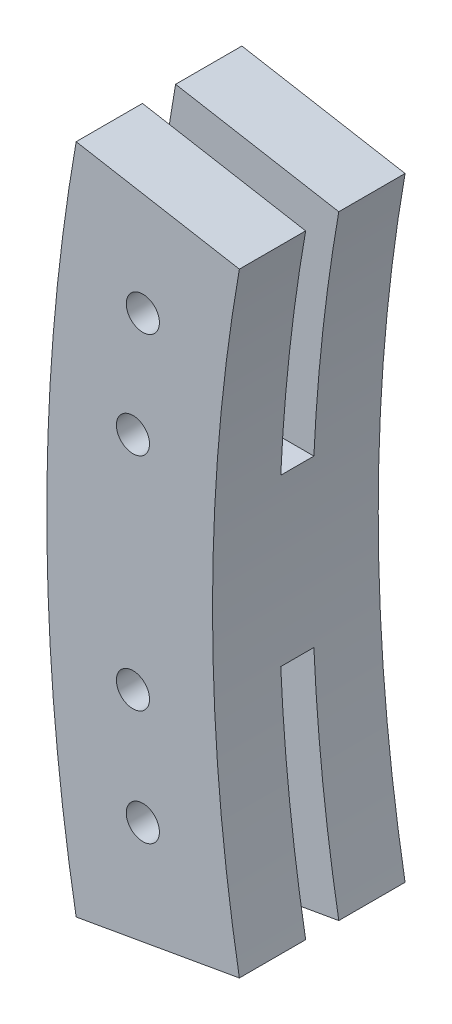
ISO-10303-21;
HEADER;
FILE_DESCRIPTION(('STEP AP214'),'2;1');
FILE_NAME('part.step','',(''),(''),'','','');
FILE_SCHEMA(('AUTOMOTIVE_DESIGN { 1 0 10303 214 1 1 1 1 }'));
ENDSEC;
DATA;
#1=APPLICATION_CONTEXT('core data for automotive mechanical design processes');
#2=APPLICATION_PROTOCOL_DEFINITION('international standard','automotive_design',2000,#1);
#3=PRODUCT_CONTEXT('',#1,'mechanical');
#4=PRODUCT('Part','Part','',(#3));
#5=PRODUCT_RELATED_PRODUCT_CATEGORY('part','',(#4));
#6=PRODUCT_DEFINITION_FORMATION('','',#4);
#7=PRODUCT_DEFINITION_CONTEXT('part definition',#1,'design');
#8=PRODUCT_DEFINITION('design','',#6,#7);
#9=PRODUCT_DEFINITION_SHAPE('','',#8);
#10=(LENGTH_UNIT() NAMED_UNIT(*) SI_UNIT(.MILLI.,.METRE.));
#11=(NAMED_UNIT(*) PLANE_ANGLE_UNIT() SI_UNIT($,.RADIAN.));
#12=(NAMED_UNIT(*) SI_UNIT($,.STERADIAN.) SOLID_ANGLE_UNIT());
#13=UNCERTAINTY_MEASURE_WITH_UNIT(LENGTH_MEASURE(1.E-05),#10,'distance_accuracy_value','');
#14=(GEOMETRIC_REPRESENTATION_CONTEXT(3) GLOBAL_UNCERTAINTY_ASSIGNED_CONTEXT((#13)) GLOBAL_UNIT_ASSIGNED_CONTEXT((#10,
#11,#12)) REPRESENTATION_CONTEXT('',''));
#15=CARTESIAN_POINT('',(0.,0.,0.));
#16=DIRECTION('',(0.,0.,1.));
#17=DIRECTION('',(1.,0.,0.));
#18=AXIS2_PLACEMENT_3D('',#15,#16,#17);
#19=CARTESIAN_POINT('',(0.,0.,-7.5));
#20=DIRECTION('',(0.,0.,1.));
#21=DIRECTION('',(1.,0.,0.));
#22=AXIS2_PLACEMENT_3D('',#19,#20,#21);
#23=PLANE('',#22);
#24=CARTESIAN_POINT('',(-167.20122607206,10.,-7.5));
#25=DIRECTION('',(0.,0.,1.));
#26=DIRECTION('',(1.,0.,0.));
#27=AXIS2_PLACEMENT_3D('',#24,#25,#26);
#28=CIRCLE('',#27,1.5);
#29=CARTESIAN_POINT('',(-165.70122607206,10.,-7.5));
#30=VERTEX_POINT('',#29);
#31=EDGE_CURVE('E134',#30,#30,#28,.T.);
#32=ORIENTED_EDGE('',*,*,#31,.T.);
#33=EDGE_LOOP('',(#32));
#34=FACE_BOUND('',#33,.T.);
#35=CARTESIAN_POINT('',(-167.20122607206,-9.99999999999996,-7.5));
#36=DIRECTION('',(0.,0.,-1.));
#37=DIRECTION('',(-1.,0.,0.));
#38=AXIS2_PLACEMENT_3D('',#35,#36,#37);
#39=CIRCLE('',#38,1.5);
#40=CARTESIAN_POINT('',(-168.70122607206,-9.99999999999996,-7.5));
#41=VERTEX_POINT('',#40);
#42=EDGE_CURVE('E140',#41,#41,#39,.T.);
#43=ORIENTED_EDGE('',*,*,#42,.F.);
#44=EDGE_LOOP('',(#43));
#45=FACE_BOUND('',#44,.T.);
#46=CARTESIAN_POINT('',(-166.306502188652,-19.9598930301715,-7.5));
#47=DIRECTION('',(0.,0.,-1.));
#48=DIRECTION('',(-1.,0.,0.));
#49=AXIS2_PLACEMENT_3D('',#46,#47,#48);
#50=CIRCLE('',#49,1.5);
#51=CARTESIAN_POINT('',(-167.806502188652,-19.9598930301715,-7.5));
#52=VERTEX_POINT('',#51);
#53=EDGE_CURVE('E146',#52,#52,#50,.T.);
#54=ORIENTED_EDGE('',*,*,#53,.F.);
#55=EDGE_LOOP('',(#54));
#56=FACE_BOUND('',#55,.T.);
#57=DIRECTION('',(-0.984807753012208,0.173648177666931,0.));
#58=VECTOR('',#57,1.);
#59=CARTESIAN_POINT('',(0.,0.,-7.5));
#60=LINE('',#59,#58);
#61=CARTESIAN_POINT('',(-157.569240481953,27.7837084267089,-7.5));
#62=VERTEX_POINT('',#61);
#63=CARTESIAN_POINT('',(-172.341356777136,30.3884310917129,-7.5));
#64=VERTEX_POINT('',#63);
#65=EDGE_CURVE('E109',#62,#64,#60,.T.);
#66=ORIENTED_EDGE('',*,*,#65,.F.);
#67=CARTESIAN_POINT('',(0.,0.,-7.5));
#68=DIRECTION('',(0.,0.,1.));
#69=DIRECTION('',(1.,0.,0.));
#70=AXIS2_PLACEMENT_3D('',#67,#68,#69);
#71=CIRCLE('',#70,160.);
#72=CARTESIAN_POINT('',(-157.569240481953,-27.783708426709,-7.5));
#73=VERTEX_POINT('',#72);
#74=EDGE_CURVE('E108',#62,#73,#71,.T.);
#75=ORIENTED_EDGE('',*,*,#74,.T.);
#76=DIRECTION('',(-0.984807753012208,-0.173648177666931,0.));
#77=VECTOR('',#76,1.);
#78=CARTESIAN_POINT('',(0.,0.,-7.5));
#79=LINE('',#78,#77);
#80=CARTESIAN_POINT('',(-172.341356777136,-30.388431091713,-7.5));
#81=VERTEX_POINT('',#80);
#82=EDGE_CURVE('E95',#73,#81,#79,.T.);
#83=ORIENTED_EDGE('',*,*,#82,.T.);
#84=CARTESIAN_POINT('',(0.,0.,-7.5));
#85=DIRECTION('',(0.,0.,1.));
#86=DIRECTION('',(1.,0.,0.));
#87=AXIS2_PLACEMENT_3D('',#84,#85,#86);
#88=CIRCLE('',#87,175.);
#89=EDGE_CURVE('E237',#64,#81,#88,.T.);
#90=ORIENTED_EDGE('',*,*,#89,.F.);
#91=EDGE_LOOP('',(#66,#75,#83,#90));
#92=FACE_BOUND('',#91,.T.);
#93=CARTESIAN_POINT('',(-166.306502188652,19.9598930301716,-7.5));
#94=DIRECTION('',(0.,0.,1.));
#95=DIRECTION('',(1.,0.,0.));
#96=AXIS2_PLACEMENT_3D('',#93,#94,#95);
#97=CIRCLE('',#96,1.5);
#98=CARTESIAN_POINT('',(-164.806502188652,19.9598930301716,-7.5));
#99=VERTEX_POINT('',#98);
#100=EDGE_CURVE('E120',#99,#99,#97,.T.);
#101=ORIENTED_EDGE('',*,*,#100,.T.);
#102=EDGE_LOOP('',(#101));
#103=FACE_BOUND('',#102,.T.);
#104=ADVANCED_FACE('F35',(#34,#45,#56,#92,#103),#23,.F.);
#105=CARTESIAN_POINT('',(0.,0.,7.5));
#106=DIRECTION('',(0.,0.,1.));
#107=DIRECTION('',(1.,0.,0.));
#108=AXIS2_PLACEMENT_3D('',#105,#106,#107);
#109=PLANE('',#108);
#110=CARTESIAN_POINT('',(-167.20122607206,-9.99999999999996,7.5));
#111=DIRECTION('',(0.,0.,-1.));
#112=DIRECTION('',(-1.,0.,0.));
#113=AXIS2_PLACEMENT_3D('',#110,#111,#112);
#114=CIRCLE('',#113,1.5);
#115=CARTESIAN_POINT('',(-168.70122607206,-9.99999999999996,7.5));
#116=VERTEX_POINT('',#115);
#117=EDGE_CURVE('E137',#116,#116,#114,.T.);
#118=ORIENTED_EDGE('',*,*,#117,.T.);
#119=EDGE_LOOP('',(#118));
#120=FACE_BOUND('',#119,.T.);
#121=CARTESIAN_POINT('',(-166.306502188652,-19.9598930301715,7.5));
#122=DIRECTION('',(0.,0.,-1.));
#123=DIRECTION('',(-1.,0.,0.));
#124=AXIS2_PLACEMENT_3D('',#121,#122,#123);
#125=CIRCLE('',#124,1.5);
#126=CARTESIAN_POINT('',(-167.806502188652,-19.9598930301715,7.5));
#127=VERTEX_POINT('',#126);
#128=EDGE_CURVE('E143',#127,#127,#125,.T.);
#129=ORIENTED_EDGE('',*,*,#128,.T.);
#130=EDGE_LOOP('',(#129));
#131=FACE_BOUND('',#130,.T.);
#132=DIRECTION('',(-0.984807753012208,0.173648177666931,0.));
#133=VECTOR('',#132,1.);
#134=CARTESIAN_POINT('',(0.,0.,7.5));
#135=LINE('',#134,#133);
#136=CARTESIAN_POINT('',(-157.569240481953,27.7837084267089,7.5));
#137=VERTEX_POINT('',#136);
#138=CARTESIAN_POINT('',(-172.341356777136,30.3884310917129,7.5));
#139=VERTEX_POINT('',#138);
#140=EDGE_CURVE('E283',#137,#139,#135,.T.);
#141=ORIENTED_EDGE('',*,*,#140,.T.);
#142=CARTESIAN_POINT('',(0.,0.,7.5));
#143=DIRECTION('',(0.,0.,1.));
#144=DIRECTION('',(1.,0.,0.));
#145=AXIS2_PLACEMENT_3D('',#142,#143,#144);
#146=CIRCLE('',#145,175.);
#147=CARTESIAN_POINT('',(-172.341356777136,-30.388431091713,7.5));
#148=VERTEX_POINT('',#147);
#149=EDGE_CURVE('E280',#139,#148,#146,.T.);
#150=ORIENTED_EDGE('',*,*,#149,.T.);
#151=DIRECTION('',(-0.984807753012208,-0.173648177666931,0.));
#152=VECTOR('',#151,1.);
#153=CARTESIAN_POINT('',(0.,0.,7.5));
#154=LINE('',#153,#152);
#155=CARTESIAN_POINT('',(-157.569240481953,-27.783708426709,7.5));
#156=VERTEX_POINT('',#155);
#157=EDGE_CURVE('E277',#156,#148,#154,.T.);
#158=ORIENTED_EDGE('',*,*,#157,.F.);
#159=CARTESIAN_POINT('',(0.,0.,7.5));
#160=DIRECTION('',(0.,0.,1.));
#161=DIRECTION('',(1.,0.,0.));
#162=AXIS2_PLACEMENT_3D('',#159,#160,#161);
#163=CIRCLE('',#162,160.);
#164=EDGE_CURVE('E274',#137,#156,#163,.T.);
#165=ORIENTED_EDGE('',*,*,#164,.F.);
#166=EDGE_LOOP('',(#141,#150,#158,#165));
#167=FACE_BOUND('',#166,.T.);
#168=CARTESIAN_POINT('',(-167.20122607206,10.,7.5));
#169=DIRECTION('',(0.,0.,1.));
#170=DIRECTION('',(1.,0.,0.));
#171=AXIS2_PLACEMENT_3D('',#168,#169,#170);
#172=CIRCLE('',#171,1.5);
#173=CARTESIAN_POINT('',(-165.70122607206,10.,7.5));
#174=VERTEX_POINT('',#173);
#175=EDGE_CURVE('E131',#174,#174,#172,.T.);
#176=ORIENTED_EDGE('',*,*,#175,.F.);
#177=EDGE_LOOP('',(#176));
#178=FACE_BOUND('',#177,.T.);
#179=CARTESIAN_POINT('',(-166.306502188652,19.9598930301716,7.5));
#180=DIRECTION('',(0.,0.,1.));
#181=DIRECTION('',(1.,0.,0.));
#182=AXIS2_PLACEMENT_3D('',#179,#180,#181);
#183=CIRCLE('',#182,1.5);
#184=CARTESIAN_POINT('',(-164.806502188652,19.9598930301716,7.5));
#185=VERTEX_POINT('',#184);
#186=EDGE_CURVE('E126',#185,#185,#183,.T.);
#187=ORIENTED_EDGE('',*,*,#186,.F.);
#188=EDGE_LOOP('',(#187));
#189=FACE_BOUND('',#188,.T.);
#190=ADVANCED_FACE('F191',(#120,#131,#167,#178,#189),#109,.T.);
#191=CARTESIAN_POINT('',(0.,0.,-1.5));
#192=DIRECTION('',(0.,0.,1.));
#193=DIRECTION('',(1.,0.,0.));
#194=AXIS2_PLACEMENT_3D('',#191,#192,#193);
#195=PLANE('',#194);
#196=CARTESIAN_POINT('',(-166.306502188652,19.9598930301716,-1.5));
#197=DIRECTION('',(0.,0.,1.));
#198=DIRECTION('',(1.,0.,0.));
#199=AXIS2_PLACEMENT_3D('',#196,#197,#198);
#200=CIRCLE('',#199,1.5);
#201=CARTESIAN_POINT('',(-164.806502188652,19.9598930301716,-1.5));
#202=VERTEX_POINT('',#201);
#203=EDGE_CURVE('E151',#202,#202,#200,.T.);
#204=ORIENTED_EDGE('',*,*,#203,.F.);
#205=EDGE_LOOP('',(#204));
#206=FACE_BOUND('',#205,.T.);
#207=CARTESIAN_POINT('',(-167.20122607206,10.,-1.5));
#208=DIRECTION('',(0.,0.,1.));
#209=DIRECTION('',(1.,0.,0.));
#210=AXIS2_PLACEMENT_3D('',#207,#208,#209);
#211=CIRCLE('',#210,1.5);
#212=CARTESIAN_POINT('',(-165.70122607206,10.,-1.5));
#213=VERTEX_POINT('',#212);
#214=EDGE_CURVE('E119',#213,#213,#211,.T.);
#215=ORIENTED_EDGE('',*,*,#214,.F.);
#216=EDGE_LOOP('',(#215));
#217=FACE_BOUND('',#216,.T.);
#218=CARTESIAN_POINT('',(0.,0.,-1.5));
#219=DIRECTION('',(0.,0.,1.));
#220=DIRECTION('',(1.,0.,0.));
#221=AXIS2_PLACEMENT_3D('',#218,#219,#220);
#222=CIRCLE('',#221,175.);
#223=CARTESIAN_POINT('',(-172.341356777136,30.3884310917129,-1.5));
#224=VERTEX_POINT('',#223);
#225=CARTESIAN_POINT('',(-174.839211849059,7.5,-1.5));
#226=VERTEX_POINT('',#225);
#227=EDGE_CURVE('E44',#224,#226,#222,.T.);
#228=ORIENTED_EDGE('',*,*,#227,.T.);
#229=DIRECTION('',(1.,0.,0.));
#230=VECTOR('',#229,1.);
#231=CARTESIAN_POINT('',(0.,7.5,-1.5));
#232=LINE('',#231,#230);
#233=CARTESIAN_POINT('',(-159.824122084246,7.5,-1.5));
#234=VERTEX_POINT('',#233);
#235=EDGE_CURVE('E91',#226,#234,#232,.T.);
#236=ORIENTED_EDGE('',*,*,#235,.T.);
#237=CARTESIAN_POINT('',(0.,0.,-1.5));
#238=DIRECTION('',(0.,0.,-1.));
#239=DIRECTION('',(1.,0.,0.));
#240=AXIS2_PLACEMENT_3D('',#237,#238,#239);
#241=CIRCLE('',#240,160.);
#242=CARTESIAN_POINT('',(-157.569240481953,27.7837084267089,-1.5));
#243=VERTEX_POINT('',#242);
#244=EDGE_CURVE('E85',#234,#243,#241,.T.);
#245=ORIENTED_EDGE('',*,*,#244,.T.);
#246=DIRECTION('',(-0.984807753012208,0.173648177666931,0.));
#247=VECTOR('',#246,1.);
#248=CARTESIAN_POINT('',(-157.569240481953,27.7837084267089,-1.5));
#249=LINE('',#248,#247);
#250=EDGE_CURVE('E89',#243,#224,#249,.T.);
#251=ORIENTED_EDGE('',*,*,#250,.T.);
#252=EDGE_LOOP('',(#228,#236,#245,#251));
#253=FACE_BOUND('',#252,.T.);
#254=ADVANCED_FACE('F88',(#206,#217,#253),#195,.T.);
#255=CARTESIAN_POINT('',(0.,0.,7.5));
#256=DIRECTION('',(-0.173648177666931,-0.984807753012208,0.));
#257=DIRECTION('',(0.984807753012208,-0.173648177666931,0.));
#258=AXIS2_PLACEMENT_3D('',#255,#256,#257);
#259=PLANE('',#258);
#260=ORIENTED_EDGE('',*,*,#250,.F.);
#261=DIRECTION('',(0.,0.,-1.));
#262=VECTOR('',#261,1.);
#263=CARTESIAN_POINT('',(-157.569240481953,27.7837084267089,7.5));
#264=LINE('',#263,#262);
#265=EDGE_CURVE('E100',#243,#62,#264,.T.);
#266=ORIENTED_EDGE('',*,*,#265,.T.);
#267=ORIENTED_EDGE('',*,*,#65,.T.);
#268=DIRECTION('',(0.,0.,-1.));
#269=VECTOR('',#268,1.);
#270=CARTESIAN_POINT('',(-172.341356777136,30.3884310917129,7.5));
#271=LINE('',#270,#269);
#272=EDGE_CURVE('E102',#224,#64,#271,.T.);
#273=ORIENTED_EDGE('',*,*,#272,.F.);
#274=EDGE_LOOP('',(#260,#266,#267,#273));
#275=FACE_BOUND('',#274,.T.);
#276=ADVANCED_FACE('F37',(#275),#259,.F.);
#277=CARTESIAN_POINT('',(0.,0.,7.5));
#278=DIRECTION('',(0.,0.,-1.));
#279=DIRECTION('',(-1.,0.,0.));
#280=AXIS2_PLACEMENT_3D('',#277,#278,#279);
#281=CYLINDRICAL_SURFACE('',#280,175.);
#282=CARTESIAN_POINT('',(-175.,0.,-1.5));
#283=CARTESIAN_POINT('',(-174.999999913087,-0.0842539981002854,-1.49999626429253));
#284=CARTESIAN_POINT('',(-174.9999385004,-0.168569048889401,-1.49287744371549));
#285=CARTESIAN_POINT('',(-174.999699416798,-0.334876956073419,-1.46457790654883));
#286=CARTESIAN_POINT('',(-174.999521606038,-0.416866895229878,-1.44338027480643));
#287=CARTESIAN_POINT('',(-174.99906986877,-0.576091135793916,-1.38752670941955));
#288=CARTESIAN_POINT('',(-174.998795988266,-0.653327692721194,-1.35287721673627));
#289=CARTESIAN_POINT('',(-174.99818302927,-0.800865758753462,-1.27111238033642));
#290=CARTESIAN_POINT('',(-174.99784396697,-0.871168983804904,-1.22400013173894));
#291=CARTESIAN_POINT('',(-174.997138776512,-1.0028786120964,-1.11863633350978));
#292=CARTESIAN_POINT('',(-174.996772644905,-1.06428387905839,-1.06038336339651));
#293=CARTESIAN_POINT('',(-174.996054613441,-1.17644540381245,-0.934392884934507));
#294=CARTESIAN_POINT('',(-174.995702714142,-1.2272012429254,-0.866655003863788));
#295=CARTESIAN_POINT('',(-174.995052839266,-1.31662012539143,-0.723619452352819));
#296=CARTESIAN_POINT('',(-174.994754863514,-1.35528320797274,-0.648321806437072));
#297=CARTESIAN_POINT('',(-174.994246431545,-1.41941902751253,-0.49230412014581));
#298=CARTESIAN_POINT('',(-174.994035975138,-1.44489179314496,-0.411584091558253));
#299=CARTESIAN_POINT('',(-174.993726314644,-1.48192343684925,-0.247014883143222));
#300=CARTESIAN_POINT('',(-174.993627107997,-1.49348263504592,-0.163165775355696));
#301=CARTESIAN_POINT('',(-174.993551124336,-1.5023599811446,0.0052828471563461));
#302=CARTESIAN_POINT('',(-174.99357434708,-1.49967815725306,0.0898823603942417));
#303=CARTESIAN_POINT('',(-174.993740600989,-1.48014993194049,0.257428104259199));
#304=CARTESIAN_POINT('',(-174.99388362905,-1.46330389767909,0.340374377683902));
#305=CARTESIAN_POINT('',(-174.994273363696,-1.41592600483894,0.502261468008677));
#306=CARTESIAN_POINT('',(-174.994520070401,-1.38539413053022,0.581202280304911));
#307=CARTESIAN_POINT('',(-174.995089351861,-1.31151084604064,0.732838642706464));
#308=CARTESIAN_POINT('',(-174.995411927606,-1.26815926867532,0.805534111348975));
#309=CARTESIAN_POINT('',(-174.996096578318,-1.16986734221279,0.942615265735669));
#310=CARTESIAN_POINT('',(-174.996458653278,-1.11492699526062,1.00700095301795));
#311=CARTESIAN_POINT('',(-174.997181495783,-0.995014996679886,1.12563703563681));
#312=CARTESIAN_POINT('',(-174.997542263285,-0.930043021098069,1.17988710353685));
#313=CARTESIAN_POINT('',(-174.998221806173,-0.791913261556919,1.27670943652117));
#314=CARTESIAN_POINT('',(-174.998540581554,-0.718755476510273,1.3192817000543));
#315=CARTESIAN_POINT('',(-174.999100201379,-0.566330661241379,1.3915398762503));
#316=CARTESIAN_POINT('',(-174.999341045768,-0.487063626668137,1.42122577973544));
#317=CARTESIAN_POINT('',(-174.999717649584,-0.324670546817509,1.46686833777451));
#318=CARTESIAN_POINT('',(-174.999853409038,-0.241544502557029,1.48282499594626));
#319=CARTESIAN_POINT('',(-175.000004534374,-0.0737959351063697,1.50055570526862));
#320=CARTESIAN_POINT('',(-175.000019904089,0.0108265403673266,1.50233020782919));
#321=CARTESIAN_POINT('',(-174.999928527288,0.179168284500053,1.49164740840705));
#322=CARTESIAN_POINT('',(-174.999821780779,0.262887553207047,1.4791901071801));
#323=CARTESIAN_POINT('',(-174.999498208487,0.42704508910621,1.44039769747181));
#324=CARTESIAN_POINT('',(-174.99928138432,0.507483404468395,1.41406279281653));
#325=CARTESIAN_POINT('',(-174.998762100992,0.662797098543297,1.34826295630697));
#326=CARTESIAN_POINT('',(-174.998459641826,0.737672477007275,1.30879802386559));
#327=CARTESIAN_POINT('',(-174.997803176696,0.879736892288532,1.21785726170834));
#328=CARTESIAN_POINT('',(-174.997449169431,0.946925735178109,1.16638112905505));
#329=CARTESIAN_POINT('',(-174.996729522701,1.07170786820625,1.05287964320392));
#330=CARTESIAN_POINT('',(-174.996363883228,1.12930115278145,0.990854283889834));
#331=CARTESIAN_POINT('',(-174.995662184059,1.23325875459474,0.858013121865201));
#332=CARTESIAN_POINT('',(-174.995326125136,1.27962277767534,0.787197088950979));
#333=CARTESIAN_POINT('',(-174.994721487693,1.3598036709656,0.638786088444426));
#334=CARTESIAN_POINT('',(-174.994452909094,1.39362055565176,0.561191128673538));
#335=CARTESIAN_POINT('',(-174.994013517729,1.44774675606284,0.401426032985888));
#336=CARTESIAN_POINT('',(-174.993842703557,1.46805626597992,0.319255962862753));
#337=CARTESIAN_POINT('',(-174.993618094875,1.49459185306615,0.152672127753593));
#338=CARTESIAN_POINT('',(-174.99356430055,1.50081790793472,0.0682583592149787));
#339=CARTESIAN_POINT('',(-174.993579797556,1.49900976242179,-0.100413423687884));
#340=CARTESIAN_POINT('',(-174.993649084713,1.49097604576192,-0.184671443238411));
#341=CARTESIAN_POINT('',(-174.993902924618,1.46087735939689,-0.350642926503654));
#342=CARTESIAN_POINT('',(-174.994087477598,1.43881236150381,-0.432356385106169));
#343=CARTESIAN_POINT('',(-174.994551046033,1.3812770652008,-0.59092052042463));
#344=CARTESIAN_POINT('',(-174.994830063241,1.34580651801562,-0.667771106866285));
#345=CARTESIAN_POINT('',(-174.995451089127,1.26246856315858,-0.814423583768403));
#346=CARTESIAN_POINT('',(-174.995793095346,1.21460163910882,-0.884225749062564));
#347=CARTESIAN_POINT('',(-174.996501526296,1.10783360846579,-1.0147988744756));
#348=CARTESIAN_POINT('',(-174.996867949252,1.04893330288637,-1.07557048963051));
#349=CARTESIAN_POINT('',(-174.997584023425,0.921748899138063,-1.18637815224522));
#350=CARTESIAN_POINT('',(-174.997933670451,0.85346247299401,-1.23641152846295));
#351=CARTESIAN_POINT('',(-174.998576831459,0.709431152478615,-1.32432342860368));
#352=CARTESIAN_POINT('',(-174.998870317775,0.633682609846378,-1.36219596811354));
#353=CARTESIAN_POINT('',(-174.999367491774,0.476961470583162,-1.42464269878833));
#354=CARTESIAN_POINT('',(-174.999571287008,0.395995264969682,-1.44923282537757));
#355=CARTESIAN_POINT('',(-174.999811358783,0.262094521571189,-1.47786592707692));
#356=CARTESIAN_POINT('',(-174.999881794324,0.210029966917086,-1.48615583858969));
#357=CARTESIAN_POINT('',(-174.999976142099,0.105318228114394,-1.49722404266754));
#358=CARTESIAN_POINT('',(-175.000000054333,0.0526710439795123,-1.50000233536232));
#359=CARTESIAN_POINT('',(-175.,0.,-1.5));
#360=B_SPLINE_CURVE_WITH_KNOTS('',3,(#282,#283,#284,#285,#286,#287,#288,#289,#290,#291,#292,
#293,#294,#295,#296,#297,#298,#299,#300,#301,#302,#303,#304,#305,#306,#307,#308,#309,#310,#311,
#312,#313,#314,#315,#316,#317,#318,#319,#320,#321,#322,#323,#324,#325,#326,#327,#328,#329,#330,
#331,#332,#333,#334,#335,#336,#337,#338,#339,#340,#341,#342,#343,#344,#345,#346,#347,#348,#349,
#350,#351,#352,#353,#354,#355,#356,#357,#358,#359),.UNSPECIFIED.,.T.,.F.,(4,2,2,2,2,2,2,2,2,2,2,
2,2,2,2,2,2,2,2,2,2,2,2,2,2,2,2,2,2,2,2,2,2,2,2,2,2,2,4),(0.,0.252569744564013,
0.505443492276881,0.758196309124637,1.01088641377386,1.26360875881588,1.51634103770182,
1.76907249672983,2.02180340635152,2.27452850100296,2.52725309509508,2.77997113835194,
3.03268947207385,3.28541110169448,3.53813268453749,3.79086243027335,4.04359220957912,
4.29632216888017,4.54905206158353,4.80177391000553,5.054495745007,5.30721386828247,
5.55993200285788,5.81265651198837,6.06538116764425,6.31811244286365,6.57084342648866,
6.82357077658483,7.07629852686397,7.32901770424676,7.58173738932734,7.83446176451714,
8.08717628161027,8.33987245895659,8.59263142427813,8.84551458369423,9.0980936717068,
9.25598662321989,9.41387957101794),.UNSPECIFIED.);
#361=CARTESIAN_POINT('',(-175.,0.,-1.5));
#362=VERTEX_POINT('',#361);
#363=EDGE_CURVE('E169',#362,#362,#360,.T.);
#364=ORIENTED_EDGE('',*,*,#363,.F.);
#365=EDGE_LOOP('',(#364));
#366=FACE_BOUND('',#365,.T.);
#367=ORIENTED_EDGE('',*,*,#227,.F.);
#368=ORIENTED_EDGE('',*,*,#272,.T.);
#369=ORIENTED_EDGE('',*,*,#89,.T.);
#370=DIRECTION('',(0.,0.,-1.));
#371=VECTOR('',#370,1.);
#372=CARTESIAN_POINT('',(-172.341356777136,-30.388431091713,7.5));
#373=LINE('',#372,#371);
#374=CARTESIAN_POINT('',(-172.341356777136,-30.388431091713,-1.5));
#375=VERTEX_POINT('',#374);
#376=EDGE_CURVE('E238',#375,#81,#373,.T.);
#377=ORIENTED_EDGE('',*,*,#376,.F.);
#378=CARTESIAN_POINT('',(-174.839211849059,-7.5,-1.5));
#379=VERTEX_POINT('',#378);
#380=EDGE_CURVE('E103',#379,#375,#222,.T.);
#381=ORIENTED_EDGE('',*,*,#380,.F.);
#382=DIRECTION('',(0.,0.,-1.));
#383=VECTOR('',#382,1.);
#384=CARTESIAN_POINT('',(-174.839211849059,-7.5,1.5));
#385=LINE('',#384,#383);
#386=CARTESIAN_POINT('',(-174.839211849059,-7.5,1.5));
#387=VERTEX_POINT('',#386);
#388=EDGE_CURVE('E247',#387,#379,#385,.T.);
#389=ORIENTED_EDGE('',*,*,#388,.F.);
#390=CARTESIAN_POINT('',(0.,0.,1.5));
#391=DIRECTION('',(0.,0.,1.));
#392=DIRECTION('',(1.,0.,0.));
#393=AXIS2_PLACEMENT_3D('',#390,#391,#392);
#394=CIRCLE('',#393,175.);
#395=CARTESIAN_POINT('',(-172.341356777136,-30.388431091713,1.5));
#396=VERTEX_POINT('',#395);
#397=EDGE_CURVE('E290',#387,#396,#394,.T.);
#398=ORIENTED_EDGE('',*,*,#397,.T.);
#399=DIRECTION('',(0.,0.,-1.));
#400=VECTOR('',#399,1.);
#401=CARTESIAN_POINT('',(-172.341356777136,-30.388431091713,7.5));
#402=LINE('',#401,#400);
#403=EDGE_CURVE('E265',#148,#396,#402,.T.);
#404=ORIENTED_EDGE('',*,*,#403,.F.);
#405=ORIENTED_EDGE('',*,*,#149,.F.);
#406=DIRECTION('',(0.,0.,-1.));
#407=VECTOR('',#406,1.);
#408=CARTESIAN_POINT('',(-172.341356777136,30.3884310917129,7.5));
#409=LINE('',#408,#407);
#410=CARTESIAN_POINT('',(-172.341356777136,30.3884310917129,1.5));
#411=VERTEX_POINT('',#410);
#412=EDGE_CURVE('E259',#139,#411,#409,.T.);
#413=ORIENTED_EDGE('',*,*,#412,.T.);
#414=CARTESIAN_POINT('',(-174.839211849059,7.5,1.5));
#415=VERTEX_POINT('',#414);
#416=EDGE_CURVE('E289',#411,#415,#394,.T.);
#417=ORIENTED_EDGE('',*,*,#416,.T.);
#418=DIRECTION('',(0.,0.,-1.));
#419=VECTOR('',#418,1.);
#420=CARTESIAN_POINT('',(-174.839211849059,7.5,1.5));
#421=LINE('',#420,#419);
#422=EDGE_CURVE('E112',#415,#226,#421,.T.);
#423=ORIENTED_EDGE('',*,*,#422,.T.);
#424=EDGE_LOOP('',(#367,#368,#369,#377,#381,#389,#398,#404,#405,#413,#417,#423));
#425=FACE_BOUND('',#424,.T.);
#426=ADVANCED_FACE('F220',(#366,#425),#281,.T.);
#427=CARTESIAN_POINT('',(0.,0.,7.5));
#428=DIRECTION('',(0.173648177666931,-0.984807753012208,0.));
#429=DIRECTION('',(0.984807753012208,0.173648177666931,0.));
#430=AXIS2_PLACEMENT_3D('',#427,#428,#429);
#431=PLANE('',#430);
#432=DIRECTION('',(0.,0.,-1.));
#433=VECTOR('',#432,1.);
#434=CARTESIAN_POINT('',(-157.569240481953,-27.783708426709,7.5));
#435=LINE('',#434,#433);
#436=CARTESIAN_POINT('',(-157.569240481953,-27.783708426709,-1.5));
#437=VERTEX_POINT('',#436);
#438=EDGE_CURVE('E115',#437,#73,#435,.T.);
#439=ORIENTED_EDGE('',*,*,#438,.F.);
#440=DIRECTION('',(0.984807753012208,0.173648177666931,0.));
#441=VECTOR('',#440,1.);
#442=CARTESIAN_POINT('',(-157.569240481953,-27.783708426709,-1.5));
#443=LINE('',#442,#441);
#444=EDGE_CURVE('E11',#375,#437,#443,.T.);
#445=ORIENTED_EDGE('',*,*,#444,.F.);
#446=ORIENTED_EDGE('',*,*,#376,.T.);
#447=ORIENTED_EDGE('',*,*,#82,.F.);
#448=EDGE_LOOP('',(#439,#445,#446,#447));
#449=FACE_BOUND('',#448,.T.);
#450=ADVANCED_FACE('F218',(#449),#431,.T.);
#451=CARTESIAN_POINT('',(0.,0.,7.5));
#452=DIRECTION('',(0.,0.,-1.));
#453=DIRECTION('',(-1.,0.,0.));
#454=AXIS2_PLACEMENT_3D('',#451,#452,#453);
#455=CYLINDRICAL_SURFACE('',#454,160.);
#456=ORIENTED_EDGE('',*,*,#265,.F.);
#457=ORIENTED_EDGE('',*,*,#244,.F.);
#458=DIRECTION('',(0.,0.,-1.));
#459=VECTOR('',#458,1.);
#460=CARTESIAN_POINT('',(-159.824122084246,7.5,1.5));
#461=LINE('',#460,#459);
#462=CARTESIAN_POINT('',(-159.824122084246,7.5,1.5));
#463=VERTEX_POINT('',#462);
#464=EDGE_CURVE('E52',#463,#234,#461,.T.);
#465=ORIENTED_EDGE('',*,*,#464,.F.);
#466=CARTESIAN_POINT('',(0.,0.,1.5));
#467=DIRECTION('',(0.,0.,-1.));
#468=DIRECTION('',(1.,0.,0.));
#469=AXIS2_PLACEMENT_3D('',#466,#467,#468);
#470=CIRCLE('',#469,160.);
#471=CARTESIAN_POINT('',(-157.569240481953,27.7837084267089,1.5));
#472=VERTEX_POINT('',#471);
#473=EDGE_CURVE('E177',#463,#472,#470,.T.);
#474=ORIENTED_EDGE('',*,*,#473,.T.);
#475=DIRECTION('',(0.,0.,-1.));
#476=VECTOR('',#475,1.);
#477=CARTESIAN_POINT('',(-157.569240481953,27.7837084267089,7.5));
#478=LINE('',#477,#476);
#479=EDGE_CURVE('E271',#137,#472,#478,.T.);
#480=ORIENTED_EDGE('',*,*,#479,.F.);
#481=ORIENTED_EDGE('',*,*,#164,.T.);
#482=DIRECTION('',(0.,0.,-1.));
#483=VECTOR('',#482,1.);
#484=CARTESIAN_POINT('',(-157.569240481953,-27.783708426709,7.5));
#485=LINE('',#484,#483);
#486=CARTESIAN_POINT('',(-157.569240481953,-27.783708426709,1.5));
#487=VERTEX_POINT('',#486);
#488=EDGE_CURVE('E268',#156,#487,#485,.T.);
#489=ORIENTED_EDGE('',*,*,#488,.T.);
#490=CARTESIAN_POINT('',(-159.824122084246,-7.5,1.5));
#491=VERTEX_POINT('',#490);
#492=EDGE_CURVE('E178',#487,#491,#470,.T.);
#493=ORIENTED_EDGE('',*,*,#492,.T.);
#494=DIRECTION('',(0.,0.,-1.));
#495=VECTOR('',#494,1.);
#496=CARTESIAN_POINT('',(-159.824122084246,-7.5,1.5));
#497=LINE('',#496,#495);
#498=CARTESIAN_POINT('',(-159.824122084246,-7.5,-1.5));
#499=VERTEX_POINT('',#498);
#500=EDGE_CURVE('E250',#491,#499,#497,.T.);
#501=ORIENTED_EDGE('',*,*,#500,.T.);
#502=EDGE_CURVE('E94',#437,#499,#241,.T.);
#503=ORIENTED_EDGE('',*,*,#502,.F.);
#504=ORIENTED_EDGE('',*,*,#438,.T.);
#505=ORIENTED_EDGE('',*,*,#74,.F.);
#506=EDGE_LOOP('',(#456,#457,#465,#474,#480,#481,#489,#493,#501,#503,#504,#505));
#507=FACE_BOUND('',#506,.T.);
#508=ADVANCED_FACE('F106',(#507),#455,.F.);
#509=CARTESIAN_POINT('',(-167.20122607206,-9.99999999999996,-1.5));
#510=DIRECTION('',(0.,0.,1.));
#511=DIRECTION('',(1.,0.,0.));
#512=AXIS2_PLACEMENT_3D('',#509,#510,#511);
#513=CIRCLE('',#512,1.5);
#514=CARTESIAN_POINT('',(-165.70122607206,-9.99999999999996,-1.5));
#515=VERTEX_POINT('',#514);
#516=EDGE_CURVE('E163',#515,#515,#513,.F.);
#517=ORIENTED_EDGE('',*,*,#516,.T.);
#518=EDGE_LOOP('',(#517));
#519=FACE_BOUND('',#518,.T.);
#520=CARTESIAN_POINT('',(-166.306502188652,-19.9598930301715,-1.5));
#521=DIRECTION('',(0.,0.,1.));
#522=DIRECTION('',(1.,0.,0.));
#523=AXIS2_PLACEMENT_3D('',#520,#521,#522);
#524=CIRCLE('',#523,1.5);
#525=CARTESIAN_POINT('',(-164.806502188652,-19.9598930301715,-1.5));
#526=VERTEX_POINT('',#525);
#527=EDGE_CURVE('E157',#526,#526,#524,.F.);
#528=ORIENTED_EDGE('',*,*,#527,.T.);
#529=EDGE_LOOP('',(#528));
#530=FACE_BOUND('',#529,.T.);
#531=DIRECTION('',(1.,0.,0.));
#532=VECTOR('',#531,1.);
#533=CARTESIAN_POINT('',(0.,-7.5,-1.5));
#534=LINE('',#533,#532);
#535=EDGE_CURVE('E254',#379,#499,#534,.T.);
#536=ORIENTED_EDGE('',*,*,#535,.F.);
#537=ORIENTED_EDGE('',*,*,#380,.T.);
#538=ORIENTED_EDGE('',*,*,#444,.T.);
#539=ORIENTED_EDGE('',*,*,#502,.T.);
#540=EDGE_LOOP('',(#536,#537,#538,#539));
#541=FACE_BOUND('',#540,.T.);
#542=ADVANCED_FACE('F209',(#519,#530,#541),#195,.T.);
#543=CARTESIAN_POINT('',(0.,7.5,1.5));
#544=DIRECTION('',(0.,1.,0.));
#545=DIRECTION('',(0.,0.,1.));
#546=AXIS2_PLACEMENT_3D('',#543,#544,#545);
#547=PLANE('',#546);
#548=ORIENTED_EDGE('',*,*,#235,.F.);
#549=ORIENTED_EDGE('',*,*,#422,.F.);
#550=DIRECTION('',(1.,0.,0.));
#551=VECTOR('',#550,1.);
#552=CARTESIAN_POINT('',(0.,7.5,1.5));
#553=LINE('',#552,#551);
#554=EDGE_CURVE('E257',#415,#463,#553,.T.);
#555=ORIENTED_EDGE('',*,*,#554,.T.);
#556=ORIENTED_EDGE('',*,*,#464,.T.);
#557=EDGE_LOOP('',(#548,#549,#555,#556));
#558=FACE_BOUND('',#557,.T.);
#559=ADVANCED_FACE('F205',(#558),#547,.T.);
#560=CARTESIAN_POINT('',(0.,-7.5,1.5));
#561=DIRECTION('',(0.,1.,0.));
#562=DIRECTION('',(0.,0.,1.));
#563=AXIS2_PLACEMENT_3D('',#560,#561,#562);
#564=PLANE('',#563);
#565=ORIENTED_EDGE('',*,*,#535,.T.);
#566=ORIENTED_EDGE('',*,*,#500,.F.);
#567=DIRECTION('',(1.,0.,0.));
#568=VECTOR('',#567,1.);
#569=CARTESIAN_POINT('',(0.,-7.5,1.5));
#570=LINE('',#569,#568);
#571=EDGE_CURVE('E253',#387,#491,#570,.T.);
#572=ORIENTED_EDGE('',*,*,#571,.F.);
#573=ORIENTED_EDGE('',*,*,#388,.T.);
#574=EDGE_LOOP('',(#565,#566,#572,#573));
#575=FACE_BOUND('',#574,.T.);
#576=ADVANCED_FACE('F202',(#575),#564,.F.);
#577=CARTESIAN_POINT('',(0.,0.,1.5));
#578=DIRECTION('',(0.,0.,1.));
#579=DIRECTION('',(1.,0.,0.));
#580=AXIS2_PLACEMENT_3D('',#577,#578,#579);
#581=PLANE('',#580);
#582=CARTESIAN_POINT('',(-167.20122607206,-9.99999999999996,1.5));
#583=DIRECTION('',(0.,0.,1.));
#584=DIRECTION('',(1.,0.,0.));
#585=AXIS2_PLACEMENT_3D('',#582,#583,#584);
#586=CIRCLE('',#585,1.5);
#587=CARTESIAN_POINT('',(-165.70122607206,-9.99999999999996,1.5));
#588=VERTEX_POINT('',#587);
#589=EDGE_CURVE('E160',#588,#588,#586,.F.);
#590=ORIENTED_EDGE('',*,*,#589,.F.);
#591=EDGE_LOOP('',(#590));
#592=FACE_BOUND('',#591,.T.);
#593=CARTESIAN_POINT('',(-166.306502188652,-19.9598930301715,1.5));
#594=DIRECTION('',(0.,0.,1.));
#595=DIRECTION('',(1.,0.,0.));
#596=AXIS2_PLACEMENT_3D('',#593,#594,#595);
#597=CIRCLE('',#596,1.5);
#598=CARTESIAN_POINT('',(-164.806502188652,-19.9598930301715,1.5));
#599=VERTEX_POINT('',#598);
#600=EDGE_CURVE('E154',#599,#599,#597,.F.);
#601=ORIENTED_EDGE('',*,*,#600,.F.);
#602=EDGE_LOOP('',(#601));
#603=FACE_BOUND('',#602,.T.);
#604=ORIENTED_EDGE('',*,*,#397,.F.);
#605=ORIENTED_EDGE('',*,*,#571,.T.);
#606=ORIENTED_EDGE('',*,*,#492,.F.);
#607=DIRECTION('',(0.984807753012208,0.173648177666931,0.));
#608=VECTOR('',#607,1.);
#609=CARTESIAN_POINT('',(-157.569240481953,-27.783708426709,1.5));
#610=LINE('',#609,#608);
#611=EDGE_CURVE('E286',#396,#487,#610,.T.);
#612=ORIENTED_EDGE('',*,*,#611,.F.);
#613=EDGE_LOOP('',(#604,#605,#606,#612));
#614=FACE_BOUND('',#613,.T.);
#615=ADVANCED_FACE('F190',(#592,#603,#614),#581,.F.);
#616=CARTESIAN_POINT('',(0.,0.,7.5));
#617=DIRECTION('',(0.173648177666931,-0.984807753012208,0.));
#618=DIRECTION('',(0.984807753012208,0.173648177666931,0.));
#619=AXIS2_PLACEMENT_3D('',#616,#617,#618);
#620=PLANE('',#619);
#621=ORIENTED_EDGE('',*,*,#611,.T.);
#622=ORIENTED_EDGE('',*,*,#488,.F.);
#623=ORIENTED_EDGE('',*,*,#157,.T.);
#624=ORIENTED_EDGE('',*,*,#403,.T.);
#625=EDGE_LOOP('',(#621,#622,#623,#624));
#626=FACE_BOUND('',#625,.T.);
#627=ADVANCED_FACE('F195',(#626),#620,.T.);
#628=CARTESIAN_POINT('',(0.,0.,7.5));
#629=DIRECTION('',(-0.173648177666931,-0.984807753012208,0.));
#630=DIRECTION('',(0.984807753012208,-0.173648177666931,0.));
#631=AXIS2_PLACEMENT_3D('',#628,#629,#630);
#632=PLANE('',#631);
#633=ORIENTED_EDGE('',*,*,#479,.T.);
#634=DIRECTION('',(-0.984807753012208,0.173648177666931,0.));
#635=VECTOR('',#634,1.);
#636=CARTESIAN_POINT('',(-157.569240481953,27.7837084267089,1.5));
#637=LINE('',#636,#635);
#638=EDGE_CURVE('E291',#472,#411,#637,.T.);
#639=ORIENTED_EDGE('',*,*,#638,.T.);
#640=ORIENTED_EDGE('',*,*,#412,.F.);
#641=ORIENTED_EDGE('',*,*,#140,.F.);
#642=EDGE_LOOP('',(#633,#639,#640,#641));
#643=FACE_BOUND('',#642,.T.);
#644=ADVANCED_FACE('F188',(#643),#632,.F.);
#645=CARTESIAN_POINT('',(-166.306502188652,19.9598930301716,1.5));
#646=DIRECTION('',(0.,0.,1.));
#647=DIRECTION('',(1.,0.,0.));
#648=AXIS2_PLACEMENT_3D('',#645,#646,#647);
#649=CIRCLE('',#648,1.5);
#650=CARTESIAN_POINT('',(-164.806502188652,19.9598930301716,1.5));
#651=VERTEX_POINT('',#650);
#652=EDGE_CURVE('E39',#651,#651,#649,.T.);
#653=ORIENTED_EDGE('',*,*,#652,.T.);
#654=EDGE_LOOP('',(#653));
#655=FACE_BOUND('',#654,.T.);
#656=CARTESIAN_POINT('',(-167.20122607206,10.,1.5));
#657=DIRECTION('',(0.,0.,1.));
#658=DIRECTION('',(1.,0.,0.));
#659=AXIS2_PLACEMENT_3D('',#656,#657,#658);
#660=CIRCLE('',#659,1.5);
#661=CARTESIAN_POINT('',(-165.70122607206,10.,1.5));
#662=VERTEX_POINT('',#661);
#663=EDGE_CURVE('E117',#662,#662,#660,.T.);
#664=ORIENTED_EDGE('',*,*,#663,.T.);
#665=EDGE_LOOP('',(#664));
#666=FACE_BOUND('',#665,.T.);
#667=ORIENTED_EDGE('',*,*,#554,.F.);
#668=ORIENTED_EDGE('',*,*,#416,.F.);
#669=ORIENTED_EDGE('',*,*,#638,.F.);
#670=ORIENTED_EDGE('',*,*,#473,.F.);
#671=EDGE_LOOP('',(#667,#668,#669,#670));
#672=FACE_BOUND('',#671,.T.);
#673=ADVANCED_FACE('F185',(#655,#666,#672),#581,.F.);
#674=CARTESIAN_POINT('',(-175.001,0.,0.));
#675=DIRECTION('',(1.,0.,0.));
#676=DIRECTION('',(0.,0.,-1.));
#677=AXIS2_PLACEMENT_3D('',#674,#675,#676);
#678=CYLINDRICAL_SURFACE('',#677,1.5);
#679=ORIENTED_EDGE('',*,*,#363,.T.);
#680=EDGE_LOOP('',(#679));
#681=FACE_BOUND('',#680,.T.);
#682=CARTESIAN_POINT('',(-167.5,0.,0.));
#683=DIRECTION('',(1.,0.,0.));
#684=DIRECTION('',(0.,0.,-1.));
#685=AXIS2_PLACEMENT_3D('',#682,#683,#684);
#686=CIRCLE('',#685,1.5);
#687=CARTESIAN_POINT('',(-167.5,0.,-1.5));
#688=VERTEX_POINT('',#687);
#689=EDGE_CURVE('E166',#688,#688,#686,.T.);
#690=ORIENTED_EDGE('',*,*,#689,.T.);
#691=EDGE_LOOP('',(#690));
#692=FACE_BOUND('',#691,.T.);
#693=ADVANCED_FACE('F180',(#681,#692),#678,.F.);
#694=CARTESIAN_POINT('',(-167.5,0.,0.));
#695=DIRECTION('',(1.,0.,0.));
#696=DIRECTION('',(0.,0.,-1.));
#697=AXIS2_PLACEMENT_3D('',#694,#695,#696);
#698=PLANE('',#697);
#699=ORIENTED_EDGE('',*,*,#689,.F.);
#700=EDGE_LOOP('',(#699));
#701=FACE_BOUND('',#700,.T.);
#702=ADVANCED_FACE('F470',(#701),#698,.F.);
#703=CARTESIAN_POINT('',(-167.20122607206,10.,-7.5));
#704=DIRECTION('',(0.,0.,1.));
#705=DIRECTION('',(1.,0.,0.));
#706=AXIS2_PLACEMENT_3D('',#703,#704,#705);
#707=CYLINDRICAL_SURFACE('',#706,1.5);
#708=ORIENTED_EDGE('',*,*,#175,.T.);
#709=EDGE_LOOP('',(#708));
#710=FACE_BOUND('',#709,.T.);
#711=ORIENTED_EDGE('',*,*,#663,.F.);
#712=EDGE_LOOP('',(#711));
#713=FACE_BOUND('',#712,.T.);
#714=ADVANCED_FACE('F368',(#710,#713),#707,.F.);
#715=CARTESIAN_POINT('',(-166.306502188652,19.9598930301716,-7.5));
#716=DIRECTION('',(0.,0.,1.));
#717=DIRECTION('',(1.,0.,0.));
#718=AXIS2_PLACEMENT_3D('',#715,#716,#717);
#719=CYLINDRICAL_SURFACE('',#718,1.5);
#720=ORIENTED_EDGE('',*,*,#186,.T.);
#721=EDGE_LOOP('',(#720));
#722=FACE_BOUND('',#721,.T.);
#723=ORIENTED_EDGE('',*,*,#652,.F.);
#724=EDGE_LOOP('',(#723));
#725=FACE_BOUND('',#724,.T.);
#726=ADVANCED_FACE('F357',(#722,#725),#719,.F.);
#727=CARTESIAN_POINT('',(-166.306502188652,-19.9598930301715,-7.5));
#728=DIRECTION('',(0.,0.,1.));
#729=DIRECTION('',(1.,0.,0.));
#730=AXIS2_PLACEMENT_3D('',#727,#728,#729);
#731=CYLINDRICAL_SURFACE('',#730,1.5);
#732=ORIENTED_EDGE('',*,*,#128,.F.);
#733=EDGE_LOOP('',(#732));
#734=FACE_BOUND('',#733,.T.);
#735=ORIENTED_EDGE('',*,*,#600,.T.);
#736=EDGE_LOOP('',(#735));
#737=FACE_BOUND('',#736,.T.);
#738=ADVANCED_FACE('F354',(#734,#737),#731,.F.);
#739=CARTESIAN_POINT('',(-167.20122607206,-9.99999999999996,-7.5));
#740=DIRECTION('',(0.,0.,1.));
#741=DIRECTION('',(1.,0.,0.));
#742=AXIS2_PLACEMENT_3D('',#739,#740,#741);
#743=CYLINDRICAL_SURFACE('',#742,1.5);
#744=ORIENTED_EDGE('',*,*,#117,.F.);
#745=EDGE_LOOP('',(#744));
#746=FACE_BOUND('',#745,.T.);
#747=ORIENTED_EDGE('',*,*,#589,.T.);
#748=EDGE_LOOP('',(#747));
#749=FACE_BOUND('',#748,.T.);
#750=ADVANCED_FACE('F356',(#746,#749),#743,.F.);
#751=ORIENTED_EDGE('',*,*,#527,.F.);
#752=EDGE_LOOP('',(#751));
#753=FACE_BOUND('',#752,.T.);
#754=ORIENTED_EDGE('',*,*,#53,.T.);
#755=EDGE_LOOP('',(#754));
#756=FACE_BOUND('',#755,.T.);
#757=ADVANCED_FACE('F360',(#753,#756),#731,.F.);
#758=ORIENTED_EDGE('',*,*,#516,.F.);
#759=EDGE_LOOP('',(#758));
#760=FACE_BOUND('',#759,.T.);
#761=ORIENTED_EDGE('',*,*,#42,.T.);
#762=EDGE_LOOP('',(#761));
#763=FACE_BOUND('',#762,.T.);
#764=ADVANCED_FACE('F367',(#760,#763),#743,.F.);
#765=ORIENTED_EDGE('',*,*,#214,.T.);
#766=EDGE_LOOP('',(#765));
#767=FACE_BOUND('',#766,.T.);
#768=ORIENTED_EDGE('',*,*,#31,.F.);
#769=EDGE_LOOP('',(#768));
#770=FACE_BOUND('',#769,.T.);
#771=ADVANCED_FACE('F378',(#767,#770),#707,.F.);
#772=ORIENTED_EDGE('',*,*,#203,.T.);
#773=EDGE_LOOP('',(#772));
#774=FACE_BOUND('',#773,.T.);
#775=ORIENTED_EDGE('',*,*,#100,.F.);
#776=EDGE_LOOP('',(#775));
#777=FACE_BOUND('',#776,.T.);
#778=ADVANCED_FACE('F371',(#774,#777),#719,.F.);
#779=CLOSED_SHELL('',(#104,#190,#254,#276,#426,#450,#508,#542,#559,#576,#615,#627,#644,#673,
#693,#702,#714,#726,#738,#750,#757,#764,#771,#778));
#780=MANIFOLD_SOLID_BREP('B2',#779);
#781=ADVANCED_BREP_SHAPE_REPRESENTATION('',(#18,#780),#14);
#782=SHAPE_DEFINITION_REPRESENTATION(#9,#781);
ENDSEC;
END-ISO-10303-21;
